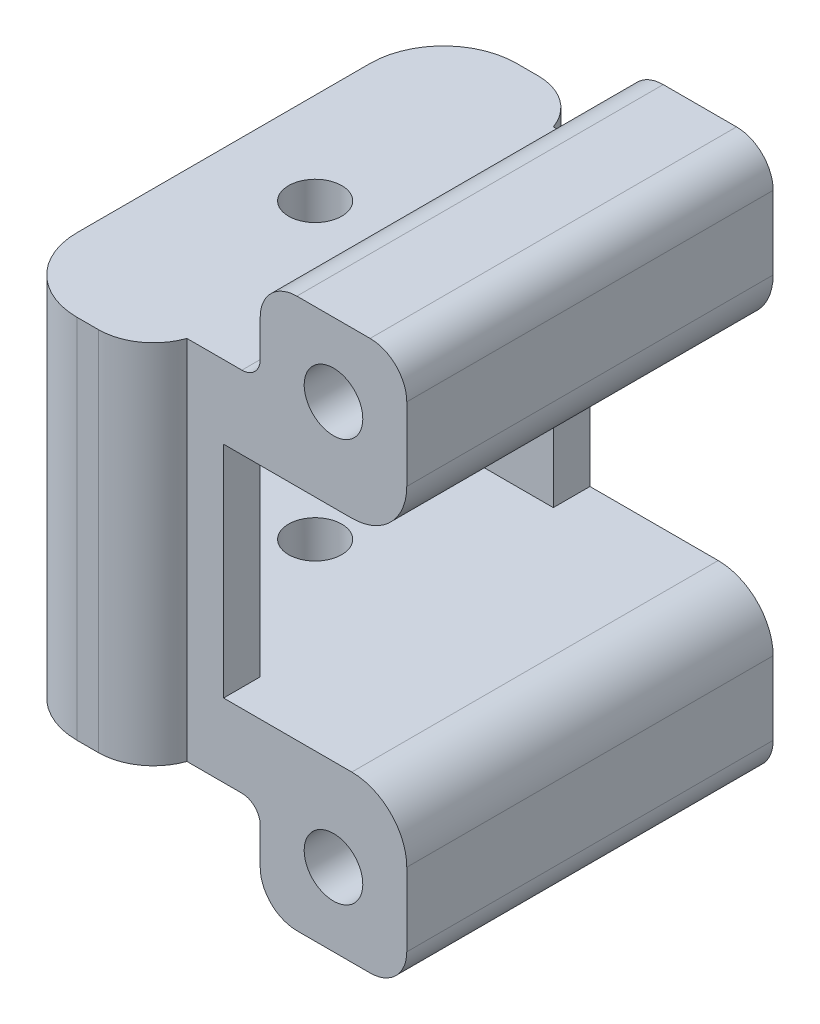
ISO-10303-21;
HEADER;
FILE_DESCRIPTION(('STEP AP214'),'2;1');
FILE_NAME('part.step','',(''),(''),'','','');
FILE_SCHEMA(('AUTOMOTIVE_DESIGN { 1 0 10303 214 1 1 1 1 }'));
ENDSEC;
DATA;
#1=APPLICATION_CONTEXT('core data for automotive mechanical design processes');
#2=APPLICATION_PROTOCOL_DEFINITION('international standard','automotive_design',2000,#1);
#3=PRODUCT_CONTEXT('',#1,'mechanical');
#4=PRODUCT('Part','Part','',(#3));
#5=PRODUCT_RELATED_PRODUCT_CATEGORY('part','',(#4));
#6=PRODUCT_DEFINITION_FORMATION('','',#4);
#7=PRODUCT_DEFINITION_CONTEXT('part definition',#1,'design');
#8=PRODUCT_DEFINITION('design','',#6,#7);
#9=PRODUCT_DEFINITION_SHAPE('','',#8);
#10=(LENGTH_UNIT() NAMED_UNIT(*) SI_UNIT(.MILLI.,.METRE.));
#11=(NAMED_UNIT(*) PLANE_ANGLE_UNIT() SI_UNIT($,.RADIAN.));
#12=(NAMED_UNIT(*) SI_UNIT($,.STERADIAN.) SOLID_ANGLE_UNIT());
#13=UNCERTAINTY_MEASURE_WITH_UNIT(LENGTH_MEASURE(1.E-05),#10,'distance_accuracy_value','');
#14=(GEOMETRIC_REPRESENTATION_CONTEXT(3) GLOBAL_UNCERTAINTY_ASSIGNED_CONTEXT((#13)) GLOBAL_UNIT_ASSIGNED_CONTEXT((#10,
#11,#12)) REPRESENTATION_CONTEXT('',''));
#15=CARTESIAN_POINT('',(0.,0.,0.));
#16=DIRECTION('',(0.,0.,1.));
#17=DIRECTION('',(1.,0.,0.));
#18=AXIS2_PLACEMENT_3D('',#15,#16,#17);
#19=CARTESIAN_POINT('',(6.,0.,0.));
#20=DIRECTION('',(1.,0.,0.));
#21=DIRECTION('',(0.,0.,-1.));
#22=AXIS2_PLACEMENT_3D('',#19,#20,#21);
#23=PLANE('',#22);
#24=DIRECTION('',(0.,0.,1.));
#25=VECTOR('',#24,1.);
#26=CARTESIAN_POINT('',(6.,0.,0.));
#27=LINE('',#26,#25);
#28=CARTESIAN_POINT('',(6.,0.,2.));
#29=VERTEX_POINT('',#28);
#30=CARTESIAN_POINT('',(6.,0.,18.));
#31=VERTEX_POINT('',#30);
#32=EDGE_CURVE('E235',#29,#31,#27,.T.);
#33=ORIENTED_EDGE('',*,*,#32,.F.);
#34=DIRECTION('',(0.,1.,0.));
#35=VECTOR('',#34,1.);
#36=CARTESIAN_POINT('',(6.,-20.,2.));
#37=LINE('',#36,#35);
#38=CARTESIAN_POINT('',(6.,-4.00000000000002,2.));
#39=VERTEX_POINT('',#38);
#40=EDGE_CURVE('E230',#29,#39,#37,.F.);
#41=ORIENTED_EDGE('',*,*,#40,.T.);
#42=DIRECTION('',(0.,0.,-1.));
#43=VECTOR('',#42,1.);
#44=CARTESIAN_POINT('',(6.,-4.,0.));
#45=LINE('',#44,#43);
#46=CARTESIAN_POINT('',(6.,-4.00000000000001,18.));
#47=VERTEX_POINT('',#46);
#48=EDGE_CURVE('E232',#47,#39,#45,.T.);
#49=ORIENTED_EDGE('',*,*,#48,.F.);
#50=DIRECTION('',(0.,-1.,0.));
#51=VECTOR('',#50,1.);
#52=CARTESIAN_POINT('',(6.,0.,18.));
#53=LINE('',#52,#51);
#54=EDGE_CURVE('E453',#47,#31,#53,.F.);
#55=ORIENTED_EDGE('',*,*,#54,.T.);
#56=EDGE_LOOP('',(#33,#41,#49,#55));
#57=FACE_BOUND('',#56,.T.);
#58=ADVANCED_FACE('F35',(#57),#23,.F.);
#59=CARTESIAN_POINT('',(4.,0.,0.));
#60=DIRECTION('',(0.,0.,1.));
#61=DIRECTION('',(0.,-1.,0.));
#62=AXIS2_PLACEMENT_3D('',#59,#60,#61);
#63=PLANE('',#62);
#64=CARTESIAN_POINT('',(22.,1.,0.));
#65=DIRECTION('',(0.,0.,-1.));
#66=DIRECTION('',(0.,1.,0.));
#67=AXIS2_PLACEMENT_3D('',#64,#65,#66);
#68=CIRCLE('',#67,1.6);
#69=CARTESIAN_POINT('',(22.,2.6,0.));
#70=VERTEX_POINT('',#69);
#71=EDGE_CURVE('E316',#70,#70,#68,.T.);
#72=ORIENTED_EDGE('',*,*,#71,.F.);
#73=EDGE_LOOP('',(#72));
#74=FACE_BOUND('',#73,.T.);
#75=CARTESIAN_POINT('',(21.9999999999991,-21.,0.));
#76=DIRECTION('',(0.,0.,-1.));
#77=DIRECTION('',(0.,1.,0.));
#78=AXIS2_PLACEMENT_3D('',#75,#76,#77);
#79=CIRCLE('',#78,1.6);
#80=CARTESIAN_POINT('',(21.9999999999991,-19.4,0.));
#81=VERTEX_POINT('',#80);
#82=EDGE_CURVE('E312',#81,#81,#79,.T.);
#83=ORIENTED_EDGE('',*,*,#82,.F.);
#84=EDGE_LOOP('',(#83));
#85=FACE_BOUND('',#84,.T.);
#86=DIRECTION('',(1.,0.,0.));
#87=VECTOR('',#86,1.);
#88=CARTESIAN_POINT('',(26.,-25.,0.));
#89=LINE('',#88,#87);
#90=CARTESIAN_POINT('',(20.,-25.,0.));
#91=VERTEX_POINT('',#90);
#92=CARTESIAN_POINT('',(24.,-25.,0.));
#93=VERTEX_POINT('',#92);
#94=EDGE_CURVE('E338',#91,#93,#89,.T.);
#95=ORIENTED_EDGE('',*,*,#94,.F.);
#96=CARTESIAN_POINT('',(20.,-23.,0.));
#97=DIRECTION('',(0.,0.,1.));
#98=DIRECTION('',(0.,-1.,0.));
#99=AXIS2_PLACEMENT_3D('',#96,#97,#98);
#100=CIRCLE('',#99,2.);
#101=CARTESIAN_POINT('',(18.,-23.,0.));
#102=VERTEX_POINT('',#101);
#103=EDGE_CURVE('E421',#91,#102,#100,.F.);
#104=ORIENTED_EDGE('',*,*,#103,.T.);
#105=DIRECTION('',(0.,1.,0.));
#106=VECTOR('',#105,1.);
#107=CARTESIAN_POINT('',(18.,-25.,0.));
#108=LINE('',#107,#106);
#109=CARTESIAN_POINT('',(18.,-21.,0.));
#110=VERTEX_POINT('',#109);
#111=EDGE_CURVE('E341',#102,#110,#108,.T.);
#112=ORIENTED_EDGE('',*,*,#111,.T.);
#113=CARTESIAN_POINT('',(17.,-21.,0.));
#114=DIRECTION('',(0.,0.,1.));
#115=DIRECTION('',(0.,-1.,0.));
#116=AXIS2_PLACEMENT_3D('',#113,#114,#115);
#117=CIRCLE('',#116,1.);
#118=CARTESIAN_POINT('',(17.,-20.,0.));
#119=VERTEX_POINT('',#118);
#120=EDGE_CURVE('E486',#110,#119,#117,.T.);
#121=ORIENTED_EDGE('',*,*,#120,.T.);
#122=DIRECTION('',(-1.,0.,0.));
#123=VECTOR('',#122,1.);
#124=CARTESIAN_POINT('',(4.,-20.,0.));
#125=LINE('',#124,#123);
#126=CARTESIAN_POINT('',(14.,-20.,0.));
#127=VERTEX_POINT('',#126);
#128=EDGE_CURVE('E377',#119,#127,#125,.T.);
#129=ORIENTED_EDGE('',*,*,#128,.T.);
#130=DIRECTION('',(0.,-1.,0.));
#131=VECTOR('',#130,1.);
#132=CARTESIAN_POINT('',(14.,-20.,0.));
#133=LINE('',#132,#131);
#134=CARTESIAN_POINT('',(14.,0.,0.));
#135=VERTEX_POINT('',#134);
#136=EDGE_CURVE('E280',#135,#127,#133,.T.);
#137=ORIENTED_EDGE('',*,*,#136,.F.);
#138=DIRECTION('',(-1.,0.,0.));
#139=VECTOR('',#138,1.);
#140=CARTESIAN_POINT('',(4.,0.,0.));
#141=LINE('',#140,#139);
#142=CARTESIAN_POINT('',(17.,0.,0.));
#143=VERTEX_POINT('',#142);
#144=EDGE_CURVE('E383',#143,#135,#141,.T.);
#145=ORIENTED_EDGE('',*,*,#144,.F.);
#146=CARTESIAN_POINT('',(17.,1.,0.));
#147=DIRECTION('',(0.,0.,1.));
#148=DIRECTION('',(0.,-1.,0.));
#149=AXIS2_PLACEMENT_3D('',#146,#147,#148);
#150=CIRCLE('',#149,1.);
#151=CARTESIAN_POINT('',(18.,1.,0.));
#152=VERTEX_POINT('',#151);
#153=EDGE_CURVE('E11',#143,#152,#150,.T.);
#154=ORIENTED_EDGE('',*,*,#153,.T.);
#155=DIRECTION('',(0.,-1.,0.));
#156=VECTOR('',#155,1.);
#157=CARTESIAN_POINT('',(18.,5.,0.));
#158=LINE('',#157,#156);
#159=CARTESIAN_POINT('',(18.,3.,0.));
#160=VERTEX_POINT('',#159);
#161=EDGE_CURVE('E332',#160,#152,#158,.T.);
#162=ORIENTED_EDGE('',*,*,#161,.F.);
#163=CARTESIAN_POINT('',(20.,3.,0.));
#164=DIRECTION('',(0.,0.,1.));
#165=DIRECTION('',(0.,-1.,0.));
#166=AXIS2_PLACEMENT_3D('',#163,#164,#165);
#167=CIRCLE('',#166,2.);
#168=CARTESIAN_POINT('',(20.,5.,0.));
#169=VERTEX_POINT('',#168);
#170=EDGE_CURVE('E417',#160,#169,#167,.F.);
#171=ORIENTED_EDGE('',*,*,#170,.T.);
#172=DIRECTION('',(-1.,0.,0.));
#173=VECTOR('',#172,1.);
#174=CARTESIAN_POINT('',(26.,5.,0.));
#175=LINE('',#174,#173);
#176=CARTESIAN_POINT('',(24.,5.,0.));
#177=VERTEX_POINT('',#176);
#178=EDGE_CURVE('E322',#177,#169,#175,.T.);
#179=ORIENTED_EDGE('',*,*,#178,.F.);
#180=CARTESIAN_POINT('',(24.,3.,0.));
#181=DIRECTION('',(0.,0.,1.));
#182=DIRECTION('',(0.,-1.,0.));
#183=AXIS2_PLACEMENT_3D('',#180,#181,#182);
#184=CIRCLE('',#183,2.);
#185=CARTESIAN_POINT('',(26.,3.,0.));
#186=VERTEX_POINT('',#185);
#187=EDGE_CURVE('E415',#177,#186,#184,.F.);
#188=ORIENTED_EDGE('',*,*,#187,.T.);
#189=DIRECTION('',(0.,1.,0.));
#190=VECTOR('',#189,1.);
#191=CARTESIAN_POINT('',(26.,0.,0.));
#192=LINE('',#191,#190);
#193=CARTESIAN_POINT('',(26.,-1.,0.));
#194=VERTEX_POINT('',#193);
#195=EDGE_CURVE('E348',#194,#186,#192,.T.);
#196=ORIENTED_EDGE('',*,*,#195,.F.);
#197=CARTESIAN_POINT('',(23.,-1.,0.));
#198=DIRECTION('',(0.,0.,1.));
#199=DIRECTION('',(0.,-1.,0.));
#200=AXIS2_PLACEMENT_3D('',#197,#198,#199);
#201=CIRCLE('',#200,3.);
#202=CARTESIAN_POINT('',(23.,-4.,0.));
#203=VERTEX_POINT('',#202);
#204=EDGE_CURVE('E399',#194,#203,#201,.F.);
#205=ORIENTED_EDGE('',*,*,#204,.T.);
#206=DIRECTION('',(-1.,0.,0.));
#207=VECTOR('',#206,1.);
#208=CARTESIAN_POINT('',(26.,-4.,0.));
#209=LINE('',#208,#207);
#210=CARTESIAN_POINT('',(16.,-4.,0.));
#211=VERTEX_POINT('',#210);
#212=EDGE_CURVE('E353',#203,#211,#209,.T.);
#213=ORIENTED_EDGE('',*,*,#212,.T.);
#214=DIRECTION('',(0.,1.,0.));
#215=VECTOR('',#214,1.);
#216=CARTESIAN_POINT('',(16.,0.,0.));
#217=LINE('',#216,#215);
#218=CARTESIAN_POINT('',(16.,-16.,0.));
#219=VERTEX_POINT('',#218);
#220=EDGE_CURVE('E371',#219,#211,#217,.T.);
#221=ORIENTED_EDGE('',*,*,#220,.F.);
#222=DIRECTION('',(-1.,0.,0.));
#223=VECTOR('',#222,1.);
#224=CARTESIAN_POINT('',(26.,-16.,0.));
#225=LINE('',#224,#223);
#226=CARTESIAN_POINT('',(23.,-16.,0.));
#227=VERTEX_POINT('',#226);
#228=EDGE_CURVE('E369',#227,#219,#225,.T.);
#229=ORIENTED_EDGE('',*,*,#228,.F.);
#230=CARTESIAN_POINT('',(23.,-19.,0.));
#231=DIRECTION('',(0.,0.,1.));
#232=DIRECTION('',(0.,-1.,0.));
#233=AXIS2_PLACEMENT_3D('',#230,#231,#232);
#234=CIRCLE('',#233,3.);
#235=CARTESIAN_POINT('',(26.,-19.,0.));
#236=VERTEX_POINT('',#235);
#237=EDGE_CURVE('E401',#227,#236,#234,.F.);
#238=ORIENTED_EDGE('',*,*,#237,.T.);
#239=DIRECTION('',(0.,1.,0.));
#240=VECTOR('',#239,1.);
#241=CARTESIAN_POINT('',(26.,-20.,0.));
#242=LINE('',#241,#240);
#243=CARTESIAN_POINT('',(26.,-23.,0.));
#244=VERTEX_POINT('',#243);
#245=EDGE_CURVE('E359',#244,#236,#242,.T.);
#246=ORIENTED_EDGE('',*,*,#245,.F.);
#247=CARTESIAN_POINT('',(24.,-23.,0.));
#248=DIRECTION('',(0.,0.,1.));
#249=DIRECTION('',(0.,-1.,0.));
#250=AXIS2_PLACEMENT_3D('',#247,#248,#249);
#251=CIRCLE('',#250,2.);
#252=EDGE_CURVE('E419',#244,#93,#251,.F.);
#253=ORIENTED_EDGE('',*,*,#252,.T.);
#254=EDGE_LOOP('',(#95,#104,#112,#121,#129,#137,#145,#154,#162,#171,#179,#188,#196,#205,#213,
#221,#229,#238,#246,#253));
#255=FACE_BOUND('',#254,.T.);
#256=ADVANCED_FACE('F514',(#74,#85,#255),#63,.F.);
#257=CARTESIAN_POINT('',(4.,0.,20.));
#258=DIRECTION('',(0.,0.,-1.));
#259=DIRECTION('',(-1.,0.,0.));
#260=AXIS2_PLACEMENT_3D('',#257,#258,#259);
#261=PLANE('',#260);
#262=CARTESIAN_POINT('',(22.,1.,20.));
#263=DIRECTION('',(0.,0.,-1.));
#264=DIRECTION('',(0.,1.,0.));
#265=AXIS2_PLACEMENT_3D('',#262,#263,#264);
#266=CIRCLE('',#265,1.6);
#267=CARTESIAN_POINT('',(22.,2.6,20.));
#268=VERTEX_POINT('',#267);
#269=EDGE_CURVE('E319',#268,#268,#266,.T.);
#270=ORIENTED_EDGE('',*,*,#269,.T.);
#271=EDGE_LOOP('',(#270));
#272=FACE_BOUND('',#271,.T.);
#273=CARTESIAN_POINT('',(21.9999999999991,-21.,20.));
#274=DIRECTION('',(0.,0.,-1.));
#275=DIRECTION('',(0.,1.,0.));
#276=AXIS2_PLACEMENT_3D('',#273,#274,#275);
#277=CIRCLE('',#276,1.6);
#278=CARTESIAN_POINT('',(21.9999999999991,-19.4,20.));
#279=VERTEX_POINT('',#278);
#280=EDGE_CURVE('E313',#279,#279,#277,.T.);
#281=ORIENTED_EDGE('',*,*,#280,.T.);
#282=EDGE_LOOP('',(#281));
#283=FACE_BOUND('',#282,.T.);
#284=DIRECTION('',(0.,1.,0.));
#285=VECTOR('',#284,1.);
#286=CARTESIAN_POINT('',(18.,-25.,20.));
#287=LINE('',#286,#285);
#288=CARTESIAN_POINT('',(18.,-23.,20.));
#289=VERTEX_POINT('',#288);
#290=CARTESIAN_POINT('',(18.,-21.,20.));
#291=VERTEX_POINT('',#290);
#292=EDGE_CURVE('E344',#289,#291,#287,.T.);
#293=ORIENTED_EDGE('',*,*,#292,.F.);
#294=CARTESIAN_POINT('',(20.,-23.,20.));
#295=DIRECTION('',(0.,0.,-1.));
#296=DIRECTION('',(-1.,0.,0.));
#297=AXIS2_PLACEMENT_3D('',#294,#295,#296);
#298=CIRCLE('',#297,2.);
#299=CARTESIAN_POINT('',(20.,-25.,20.));
#300=VERTEX_POINT('',#299);
#301=EDGE_CURVE('E431',#289,#300,#298,.F.);
#302=ORIENTED_EDGE('',*,*,#301,.T.);
#303=DIRECTION('',(-1.,0.,0.));
#304=VECTOR('',#303,1.);
#305=CARTESIAN_POINT('',(26.,-25.,20.));
#306=LINE('',#305,#304);
#307=CARTESIAN_POINT('',(24.,-25.,20.));
#308=VERTEX_POINT('',#307);
#309=EDGE_CURVE('E335',#308,#300,#306,.T.);
#310=ORIENTED_EDGE('',*,*,#309,.F.);
#311=CARTESIAN_POINT('',(24.,-23.,20.));
#312=DIRECTION('',(0.,0.,-1.));
#313=DIRECTION('',(-1.,0.,0.));
#314=AXIS2_PLACEMENT_3D('',#311,#312,#313);
#315=CIRCLE('',#314,2.);
#316=CARTESIAN_POINT('',(26.,-23.,20.));
#317=VERTEX_POINT('',#316);
#318=EDGE_CURVE('E429',#308,#317,#315,.F.);
#319=ORIENTED_EDGE('',*,*,#318,.T.);
#320=DIRECTION('',(0.,-1.,0.));
#321=VECTOR('',#320,1.);
#322=CARTESIAN_POINT('',(26.,-20.,20.));
#323=LINE('',#322,#321);
#324=CARTESIAN_POINT('',(26.,-19.,20.));
#325=VERTEX_POINT('',#324);
#326=EDGE_CURVE('E361',#325,#317,#323,.T.);
#327=ORIENTED_EDGE('',*,*,#326,.F.);
#328=CARTESIAN_POINT('',(23.,-19.,20.));
#329=DIRECTION('',(0.,0.,-1.));
#330=DIRECTION('',(-1.,0.,0.));
#331=AXIS2_PLACEMENT_3D('',#328,#329,#330);
#332=CIRCLE('',#331,3.);
#333=CARTESIAN_POINT('',(23.,-16.,20.));
#334=VERTEX_POINT('',#333);
#335=EDGE_CURVE('E395',#325,#334,#332,.F.);
#336=ORIENTED_EDGE('',*,*,#335,.T.);
#337=DIRECTION('',(-1.,0.,0.));
#338=VECTOR('',#337,1.);
#339=CARTESIAN_POINT('',(26.,-16.,20.));
#340=LINE('',#339,#338);
#341=CARTESIAN_POINT('',(16.,-16.,20.));
#342=VERTEX_POINT('',#341);
#343=EDGE_CURVE('E364',#334,#342,#340,.T.);
#344=ORIENTED_EDGE('',*,*,#343,.T.);
#345=DIRECTION('',(0.,-1.,0.));
#346=VECTOR('',#345,1.);
#347=CARTESIAN_POINT('',(16.,0.,20.));
#348=LINE('',#347,#346);
#349=CARTESIAN_POINT('',(16.,-4.,20.));
#350=VERTEX_POINT('',#349);
#351=EDGE_CURVE('E374',#350,#342,#348,.T.);
#352=ORIENTED_EDGE('',*,*,#351,.F.);
#353=DIRECTION('',(-1.,0.,0.));
#354=VECTOR('',#353,1.);
#355=CARTESIAN_POINT('',(26.,-4.,20.));
#356=LINE('',#355,#354);
#357=CARTESIAN_POINT('',(23.,-4.,20.));
#358=VERTEX_POINT('',#357);
#359=EDGE_CURVE('E356',#358,#350,#356,.T.);
#360=ORIENTED_EDGE('',*,*,#359,.F.);
#361=CARTESIAN_POINT('',(23.,-1.,20.));
#362=DIRECTION('',(0.,0.,-1.));
#363=DIRECTION('',(-1.,0.,0.));
#364=AXIS2_PLACEMENT_3D('',#361,#362,#363);
#365=CIRCLE('',#364,3.);
#366=CARTESIAN_POINT('',(26.,-1.,20.));
#367=VERTEX_POINT('',#366);
#368=EDGE_CURVE('E392',#358,#367,#365,.F.);
#369=ORIENTED_EDGE('',*,*,#368,.T.);
#370=DIRECTION('',(0.,-1.,0.));
#371=VECTOR('',#370,1.);
#372=CARTESIAN_POINT('',(26.,0.,20.));
#373=LINE('',#372,#371);
#374=CARTESIAN_POINT('',(26.,3.,20.));
#375=VERTEX_POINT('',#374);
#376=EDGE_CURVE('E351',#375,#367,#373,.T.);
#377=ORIENTED_EDGE('',*,*,#376,.F.);
#378=CARTESIAN_POINT('',(24.,3.,20.));
#379=DIRECTION('',(0.,0.,-1.));
#380=DIRECTION('',(-1.,0.,0.));
#381=AXIS2_PLACEMENT_3D('',#378,#379,#380);
#382=CIRCLE('',#381,2.);
#383=CARTESIAN_POINT('',(24.,5.,20.));
#384=VERTEX_POINT('',#383);
#385=EDGE_CURVE('E425',#375,#384,#382,.F.);
#386=ORIENTED_EDGE('',*,*,#385,.T.);
#387=DIRECTION('',(1.,0.,0.));
#388=VECTOR('',#387,1.);
#389=CARTESIAN_POINT('',(26.,5.,20.));
#390=LINE('',#389,#388);
#391=CARTESIAN_POINT('',(20.,5.,20.));
#392=VERTEX_POINT('',#391);
#393=EDGE_CURVE('E327',#392,#384,#390,.T.);
#394=ORIENTED_EDGE('',*,*,#393,.F.);
#395=CARTESIAN_POINT('',(20.,3.,20.));
#396=DIRECTION('',(0.,0.,-1.));
#397=DIRECTION('',(-1.,0.,0.));
#398=AXIS2_PLACEMENT_3D('',#395,#396,#397);
#399=CIRCLE('',#398,2.);
#400=CARTESIAN_POINT('',(18.,3.,20.));
#401=VERTEX_POINT('',#400);
#402=EDGE_CURVE('E427',#392,#401,#399,.F.);
#403=ORIENTED_EDGE('',*,*,#402,.T.);
#404=DIRECTION('',(0.,-1.,0.));
#405=VECTOR('',#404,1.);
#406=CARTESIAN_POINT('',(18.,5.,20.));
#407=LINE('',#406,#405);
#408=CARTESIAN_POINT('',(18.,0.999999999999997,20.));
#409=VERTEX_POINT('',#408);
#410=EDGE_CURVE('E330',#401,#409,#407,.T.);
#411=ORIENTED_EDGE('',*,*,#410,.T.);
#412=CARTESIAN_POINT('',(17.,0.999999999999996,20.));
#413=DIRECTION('',(0.,0.,-1.));
#414=DIRECTION('',(-1.,0.,0.));
#415=AXIS2_PLACEMENT_3D('',#412,#413,#414);
#416=CIRCLE('',#415,1.);
#417=CARTESIAN_POINT('',(17.,0.,20.));
#418=VERTEX_POINT('',#417);
#419=EDGE_CURVE('E43',#409,#418,#416,.T.);
#420=ORIENTED_EDGE('',*,*,#419,.T.);
#421=DIRECTION('',(-1.,0.,0.));
#422=VECTOR('',#421,1.);
#423=CARTESIAN_POINT('',(4.,0.,20.));
#424=LINE('',#423,#422);
#425=CARTESIAN_POINT('',(14.,0.,20.));
#426=VERTEX_POINT('',#425);
#427=EDGE_CURVE('E381',#418,#426,#424,.T.);
#428=ORIENTED_EDGE('',*,*,#427,.T.);
#429=DIRECTION('',(0.,1.,0.));
#430=VECTOR('',#429,1.);
#431=CARTESIAN_POINT('',(14.,-20.,20.));
#432=LINE('',#431,#430);
#433=CARTESIAN_POINT('',(14.,-20.,20.));
#434=VERTEX_POINT('',#433);
#435=EDGE_CURVE('E286',#434,#426,#432,.T.);
#436=ORIENTED_EDGE('',*,*,#435,.F.);
#437=DIRECTION('',(-1.,0.,0.));
#438=VECTOR('',#437,1.);
#439=CARTESIAN_POINT('',(4.,-20.,20.));
#440=LINE('',#439,#438);
#441=CARTESIAN_POINT('',(17.,-20.,20.));
#442=VERTEX_POINT('',#441);
#443=EDGE_CURVE('E379',#442,#434,#440,.T.);
#444=ORIENTED_EDGE('',*,*,#443,.F.);
#445=CARTESIAN_POINT('',(17.,-21.,20.));
#446=DIRECTION('',(0.,0.,-1.));
#447=DIRECTION('',(-1.,0.,0.));
#448=AXIS2_PLACEMENT_3D('',#445,#446,#447);
#449=CIRCLE('',#448,1.);
#450=EDGE_CURVE('E488',#442,#291,#449,.T.);
#451=ORIENTED_EDGE('',*,*,#450,.T.);
#452=EDGE_LOOP('',(#293,#302,#310,#319,#327,#336,#344,#352,#360,#369,#377,#386,#394,#403,#411,
#420,#428,#436,#444,#451));
#453=FACE_BOUND('',#452,.T.);
#454=ADVANCED_FACE('F502',(#272,#283,#453),#261,.F.);
#455=CARTESIAN_POINT('',(4.,0.,0.));
#456=DIRECTION('',(0.,-1.,0.));
#457=DIRECTION('',(0.,0.,-1.));
#458=AXIS2_PLACEMENT_3D('',#455,#456,#457);
#459=PLANE('',#458);
#460=CARTESIAN_POINT('',(11.,0.,10.));
#461=DIRECTION('',(0.,1.,0.));
#462=DIRECTION('',(0.,0.,1.));
#463=AXIS2_PLACEMENT_3D('',#460,#461,#462);
#464=CIRCLE('',#463,1.45);
#465=CARTESIAN_POINT('',(11.,0.,11.45));
#466=VERTEX_POINT('',#465);
#467=EDGE_CURVE('E294',#466,#466,#464,.T.);
#468=ORIENTED_EDGE('',*,*,#467,.F.);
#469=EDGE_LOOP('',(#468));
#470=FACE_BOUND('',#469,.T.);
#471=ORIENTED_EDGE('',*,*,#427,.F.);
#472=DIRECTION('',(0.,0.,1.));
#473=VECTOR('',#472,1.);
#474=CARTESIAN_POINT('',(17.,0.,0.));
#475=LINE('',#474,#473);
#476=EDGE_CURVE('E56',#418,#143,#475,.F.);
#477=ORIENTED_EDGE('',*,*,#476,.T.);
#478=ORIENTED_EDGE('',*,*,#144,.T.);
#479=CARTESIAN_POINT('',(11.1715728752538,0.,1.));
#480=DIRECTION('',(0.,-1.,0.));
#481=DIRECTION('',(0.,0.,-1.));
#482=AXIS2_PLACEMENT_3D('',#479,#480,#481);
#483=CIRCLE('',#482,3.);
#484=CARTESIAN_POINT('',(11.1715728752538,0.,-2.));
#485=VERTEX_POINT('',#484);
#486=EDGE_CURVE('E476',#135,#485,#483,.F.);
#487=ORIENTED_EDGE('',*,*,#486,.T.);
#488=DIRECTION('',(1.,0.,0.));
#489=VECTOR('',#488,1.);
#490=CARTESIAN_POINT('',(6.,0.,-2.));
#491=LINE('',#490,#489);
#492=CARTESIAN_POINT('',(10.,0.,-2.));
#493=VERTEX_POINT('',#492);
#494=EDGE_CURVE('E281',#493,#485,#491,.T.);
#495=ORIENTED_EDGE('',*,*,#494,.F.);
#496=CARTESIAN_POINT('',(10.,0.,2.));
#497=DIRECTION('',(0.,-1.,0.));
#498=DIRECTION('',(0.,0.,-1.));
#499=AXIS2_PLACEMENT_3D('',#496,#497,#498);
#500=CIRCLE('',#499,4.);
#501=EDGE_CURVE('E451',#493,#29,#500,.F.);
#502=ORIENTED_EDGE('',*,*,#501,.T.);
#503=ORIENTED_EDGE('',*,*,#32,.T.);
#504=CARTESIAN_POINT('',(10.,0.,18.));
#505=DIRECTION('',(0.,-1.,0.));
#506=DIRECTION('',(0.,0.,-1.));
#507=AXIS2_PLACEMENT_3D('',#504,#505,#506);
#508=CIRCLE('',#507,4.);
#509=CARTESIAN_POINT('',(10.,0.,22.));
#510=VERTEX_POINT('',#509);
#511=EDGE_CURVE('E448',#31,#510,#508,.F.);
#512=ORIENTED_EDGE('',*,*,#511,.T.);
#513=DIRECTION('',(-1.,0.,0.));
#514=VECTOR('',#513,1.);
#515=CARTESIAN_POINT('',(6.,0.,22.));
#516=LINE('',#515,#514);
#517=CARTESIAN_POINT('',(11.1715728752538,0.,22.));
#518=VERTEX_POINT('',#517);
#519=EDGE_CURVE('E292',#518,#510,#516,.T.);
#520=ORIENTED_EDGE('',*,*,#519,.F.);
#521=CARTESIAN_POINT('',(11.1715728752538,0.,19.));
#522=DIRECTION('',(0.,-1.,0.));
#523=DIRECTION('',(0.,0.,-1.));
#524=AXIS2_PLACEMENT_3D('',#521,#522,#523);
#525=CIRCLE('',#524,3.);
#526=EDGE_CURVE('E473',#518,#426,#525,.F.);
#527=ORIENTED_EDGE('',*,*,#526,.T.);
#528=EDGE_LOOP('',(#471,#477,#478,#487,#495,#502,#503,#512,#520,#527));
#529=FACE_BOUND('',#528,.T.);
#530=ADVANCED_FACE('F614',(#470,#529),#459,.F.);
#531=CARTESIAN_POINT('',(4.,-20.,0.));
#532=DIRECTION('',(0.,1.,0.));
#533=DIRECTION('',(0.,0.,1.));
#534=AXIS2_PLACEMENT_3D('',#531,#532,#533);
#535=PLANE('',#534);
#536=CARTESIAN_POINT('',(11.,-20.,10.));
#537=DIRECTION('',(0.,1.,0.));
#538=DIRECTION('',(0.,0.,1.));
#539=AXIS2_PLACEMENT_3D('',#536,#537,#538);
#540=CIRCLE('',#539,1.45);
#541=CARTESIAN_POINT('',(11.,-20.,11.45));
#542=VERTEX_POINT('',#541);
#543=EDGE_CURVE('E303',#542,#542,#540,.T.);
#544=ORIENTED_EDGE('',*,*,#543,.T.);
#545=EDGE_LOOP('',(#544));
#546=FACE_BOUND('',#545,.T.);
#547=ORIENTED_EDGE('',*,*,#128,.F.);
#548=DIRECTION('',(0.,0.,-1.));
#549=VECTOR('',#548,1.);
#550=CARTESIAN_POINT('',(17.,-20.,20.));
#551=LINE('',#550,#549);
#552=EDGE_CURVE('E484',#119,#442,#551,.F.);
#553=ORIENTED_EDGE('',*,*,#552,.T.);
#554=ORIENTED_EDGE('',*,*,#443,.T.);
#555=CARTESIAN_POINT('',(11.1715728752538,-20.,19.));
#556=DIRECTION('',(0.,1.,0.));
#557=DIRECTION('',(0.,0.,1.));
#558=AXIS2_PLACEMENT_3D('',#555,#556,#557);
#559=CIRCLE('',#558,3.);
#560=CARTESIAN_POINT('',(11.1715728752538,-20.,22.));
#561=VERTEX_POINT('',#560);
#562=EDGE_CURVE('E468',#434,#561,#559,.F.);
#563=ORIENTED_EDGE('',*,*,#562,.T.);
#564=DIRECTION('',(1.,0.,0.));
#565=VECTOR('',#564,1.);
#566=CARTESIAN_POINT('',(6.,-20.,22.));
#567=LINE('',#566,#565);
#568=CARTESIAN_POINT('',(10.,-20.,22.));
#569=VERTEX_POINT('',#568);
#570=EDGE_CURVE('E289',#569,#561,#567,.T.);
#571=ORIENTED_EDGE('',*,*,#570,.F.);
#572=CARTESIAN_POINT('',(10.,-20.,18.));
#573=DIRECTION('',(0.,1.,0.));
#574=DIRECTION('',(0.,0.,1.));
#575=AXIS2_PLACEMENT_3D('',#572,#573,#574);
#576=CIRCLE('',#575,4.);
#577=CARTESIAN_POINT('',(6.,-20.,18.));
#578=VERTEX_POINT('',#577);
#579=EDGE_CURVE('E238',#569,#578,#576,.F.);
#580=ORIENTED_EDGE('',*,*,#579,.T.);
#581=DIRECTION('',(0.,0.,1.));
#582=VECTOR('',#581,1.);
#583=CARTESIAN_POINT('',(6.,-20.,0.));
#584=LINE('',#583,#582);
#585=CARTESIAN_POINT('',(6.,-20.,2.));
#586=VERTEX_POINT('',#585);
#587=EDGE_CURVE('E306',#586,#578,#584,.T.);
#588=ORIENTED_EDGE('',*,*,#587,.F.);
#589=CARTESIAN_POINT('',(10.,-20.,2.));
#590=DIRECTION('',(0.,1.,0.));
#591=DIRECTION('',(0.,0.,1.));
#592=AXIS2_PLACEMENT_3D('',#589,#590,#591);
#593=CIRCLE('',#592,4.);
#594=CARTESIAN_POINT('',(10.,-20.,-2.));
#595=VERTEX_POINT('',#594);
#596=EDGE_CURVE('E459',#586,#595,#593,.F.);
#597=ORIENTED_EDGE('',*,*,#596,.T.);
#598=DIRECTION('',(-1.,0.,0.));
#599=VECTOR('',#598,1.);
#600=CARTESIAN_POINT('',(6.,-20.,-2.));
#601=LINE('',#600,#599);
#602=CARTESIAN_POINT('',(11.1715728752538,-20.,-2.));
#603=VERTEX_POINT('',#602);
#604=EDGE_CURVE('E284',#603,#595,#601,.T.);
#605=ORIENTED_EDGE('',*,*,#604,.F.);
#606=CARTESIAN_POINT('',(11.1715728752538,-20.,1.));
#607=DIRECTION('',(0.,1.,0.));
#608=DIRECTION('',(0.,0.,1.));
#609=AXIS2_PLACEMENT_3D('',#606,#607,#608);
#610=CIRCLE('',#609,3.);
#611=EDGE_CURVE('E470',#603,#127,#610,.F.);
#612=ORIENTED_EDGE('',*,*,#611,.T.);
#613=EDGE_LOOP('',(#547,#553,#554,#563,#571,#580,#588,#597,#605,#612));
#614=FACE_BOUND('',#613,.T.);
#615=ADVANCED_FACE('F606',(#546,#614),#535,.F.);
#616=CARTESIAN_POINT('',(16.,0.,0.));
#617=DIRECTION('',(1.,0.,0.));
#618=DIRECTION('',(0.,0.,-1.));
#619=AXIS2_PLACEMENT_3D('',#616,#617,#618);
#620=PLANE('',#619);
#621=DIRECTION('',(0.,1.,0.));
#622=VECTOR('',#621,1.);
#623=CARTESIAN_POINT('',(16.,0.,2.));
#624=LINE('',#623,#622);
#625=CARTESIAN_POINT('',(16.,-16.,2.));
#626=VERTEX_POINT('',#625);
#627=CARTESIAN_POINT('',(16.,-4.00000000000002,2.));
#628=VERTEX_POINT('',#627);
#629=EDGE_CURVE('E262',#626,#628,#624,.T.);
#630=ORIENTED_EDGE('',*,*,#629,.F.);
#631=DIRECTION('',(0.,0.,1.));
#632=VECTOR('',#631,1.);
#633=CARTESIAN_POINT('',(16.,-16.,0.));
#634=LINE('',#633,#632);
#635=EDGE_CURVE('E358',#219,#626,#634,.T.);
#636=ORIENTED_EDGE('',*,*,#635,.F.);
#637=ORIENTED_EDGE('',*,*,#220,.T.);
#638=DIRECTION('',(0.,0.,1.));
#639=VECTOR('',#638,1.);
#640=CARTESIAN_POINT('',(16.,-4.,0.));
#641=LINE('',#640,#639);
#642=EDGE_CURVE('E385',#211,#628,#641,.T.);
#643=ORIENTED_EDGE('',*,*,#642,.T.);
#644=EDGE_LOOP('',(#630,#636,#637,#643));
#645=FACE_BOUND('',#644,.T.);
#646=ADVANCED_FACE('F556',(#645),#620,.T.);
#647=DIRECTION('',(0.,-1.,0.));
#648=VECTOR('',#647,1.);
#649=CARTESIAN_POINT('',(16.,0.,18.));
#650=LINE('',#649,#648);
#651=CARTESIAN_POINT('',(16.,-4.00000000000001,18.));
#652=VERTEX_POINT('',#651);
#653=CARTESIAN_POINT('',(16.,-16.,18.));
#654=VERTEX_POINT('',#653);
#655=EDGE_CURVE('E278',#652,#654,#650,.T.);
#656=ORIENTED_EDGE('',*,*,#655,.F.);
#657=DIRECTION('',(0.,0.,-1.));
#658=VECTOR('',#657,1.);
#659=CARTESIAN_POINT('',(16.,-4.,0.));
#660=LINE('',#659,#658);
#661=EDGE_CURVE('E347',#350,#652,#660,.T.);
#662=ORIENTED_EDGE('',*,*,#661,.F.);
#663=ORIENTED_EDGE('',*,*,#351,.T.);
#664=EDGE_CURVE('E367',#654,#342,#634,.T.);
#665=ORIENTED_EDGE('',*,*,#664,.F.);
#666=EDGE_LOOP('',(#656,#662,#663,#665));
#667=FACE_BOUND('',#666,.T.);
#668=ADVANCED_FACE('F570',(#667),#620,.T.);
#669=CARTESIAN_POINT('',(16.,-4.,0.));
#670=DIRECTION('',(0.,1.,0.));
#671=DIRECTION('',(0.,0.,1.));
#672=AXIS2_PLACEMENT_3D('',#669,#670,#671);
#673=PLANE('',#672);
#674=ORIENTED_EDGE('',*,*,#212,.F.);
#675=DIRECTION('',(0.,0.,-1.));
#676=VECTOR('',#675,1.);
#677=CARTESIAN_POINT('',(23.,-4.,0.));
#678=LINE('',#677,#676);
#679=EDGE_CURVE('E407',#203,#358,#678,.F.);
#680=ORIENTED_EDGE('',*,*,#679,.T.);
#681=ORIENTED_EDGE('',*,*,#359,.T.);
#682=ORIENTED_EDGE('',*,*,#661,.T.);
#683=DIRECTION('',(-1.,0.,0.));
#684=VECTOR('',#683,1.);
#685=CARTESIAN_POINT('',(26.,-4.00000000000001,18.));
#686=LINE('',#685,#684);
#687=EDGE_CURVE('E252',#652,#47,#686,.T.);
#688=ORIENTED_EDGE('',*,*,#687,.T.);
#689=ORIENTED_EDGE('',*,*,#48,.T.);
#690=DIRECTION('',(-1.,0.,0.));
#691=VECTOR('',#690,1.);
#692=CARTESIAN_POINT('',(26.,-4.00000000000002,2.));
#693=LINE('',#692,#691);
#694=EDGE_CURVE('E249',#628,#39,#693,.T.);
#695=ORIENTED_EDGE('',*,*,#694,.F.);
#696=ORIENTED_EDGE('',*,*,#642,.F.);
#697=EDGE_LOOP('',(#674,#680,#681,#682,#688,#689,#695,#696));
#698=FACE_BOUND('',#697,.T.);
#699=CARTESIAN_POINT('',(11.,-4.,10.));
#700=DIRECTION('',(0.,1.,0.));
#701=DIRECTION('',(0.,0.,1.));
#702=AXIS2_PLACEMENT_3D('',#699,#700,#701);
#703=CIRCLE('',#702,1.45);
#704=CARTESIAN_POINT('',(11.,-4.,11.45));
#705=VERTEX_POINT('',#704);
#706=EDGE_CURVE('E300',#705,#705,#703,.T.);
#707=ORIENTED_EDGE('',*,*,#706,.T.);
#708=EDGE_LOOP('',(#707));
#709=FACE_BOUND('',#708,.T.);
#710=ADVANCED_FACE('F246',(#698,#709),#673,.F.);
#711=CARTESIAN_POINT('',(16.,-16.,0.));
#712=DIRECTION('',(0.,-1.,0.));
#713=DIRECTION('',(0.,0.,-1.));
#714=AXIS2_PLACEMENT_3D('',#711,#712,#713);
#715=PLANE('',#714);
#716=ORIENTED_EDGE('',*,*,#343,.F.);
#717=DIRECTION('',(0.,0.,1.));
#718=VECTOR('',#717,1.);
#719=CARTESIAN_POINT('',(23.,-16.,0.));
#720=LINE('',#719,#718);
#721=EDGE_CURVE('E397',#334,#227,#720,.F.);
#722=ORIENTED_EDGE('',*,*,#721,.T.);
#723=ORIENTED_EDGE('',*,*,#228,.T.);
#724=ORIENTED_EDGE('',*,*,#635,.T.);
#725=DIRECTION('',(-1.,0.,0.));
#726=VECTOR('',#725,1.);
#727=CARTESIAN_POINT('',(26.,-16.,2.));
#728=LINE('',#727,#726);
#729=CARTESIAN_POINT('',(6.,-16.,2.));
#730=VERTEX_POINT('',#729);
#731=EDGE_CURVE('E263',#626,#730,#728,.T.);
#732=ORIENTED_EDGE('',*,*,#731,.T.);
#733=DIRECTION('',(0.,0.,1.));
#734=VECTOR('',#733,1.);
#735=CARTESIAN_POINT('',(6.,-16.,0.));
#736=LINE('',#735,#734);
#737=CARTESIAN_POINT('',(6.,-16.,18.));
#738=VERTEX_POINT('',#737);
#739=EDGE_CURVE('E254',#730,#738,#736,.T.);
#740=ORIENTED_EDGE('',*,*,#739,.T.);
#741=DIRECTION('',(-1.,0.,0.));
#742=VECTOR('',#741,1.);
#743=CARTESIAN_POINT('',(26.,-16.,18.));
#744=LINE('',#743,#742);
#745=EDGE_CURVE('E272',#654,#738,#744,.T.);
#746=ORIENTED_EDGE('',*,*,#745,.F.);
#747=ORIENTED_EDGE('',*,*,#664,.T.);
#748=EDGE_LOOP('',(#716,#722,#723,#724,#732,#740,#746,#747));
#749=FACE_BOUND('',#748,.T.);
#750=CARTESIAN_POINT('',(11.,-16.,10.));
#751=DIRECTION('',(0.,-1.,0.));
#752=DIRECTION('',(0.,0.,-1.));
#753=AXIS2_PLACEMENT_3D('',#750,#751,#752);
#754=CIRCLE('',#753,1.45);
#755=CARTESIAN_POINT('',(11.,-16.,8.55));
#756=VERTEX_POINT('',#755);
#757=EDGE_CURVE('E299',#756,#756,#754,.T.);
#758=ORIENTED_EDGE('',*,*,#757,.T.);
#759=EDGE_LOOP('',(#758));
#760=FACE_BOUND('',#759,.T.);
#761=ADVANCED_FACE('F552',(#749,#760),#715,.F.);
#762=CARTESIAN_POINT('',(26.,0.,0.));
#763=DIRECTION('',(1.,0.,0.));
#764=DIRECTION('',(0.,0.,-1.));
#765=AXIS2_PLACEMENT_3D('',#762,#763,#764);
#766=PLANE('',#765);
#767=ORIENTED_EDGE('',*,*,#326,.T.);
#768=DIRECTION('',(0.,0.,1.));
#769=VECTOR('',#768,1.);
#770=CARTESIAN_POINT('',(26.,-23.,0.));
#771=LINE('',#770,#769);
#772=EDGE_CURVE('E433',#317,#244,#771,.F.);
#773=ORIENTED_EDGE('',*,*,#772,.T.);
#774=ORIENTED_EDGE('',*,*,#245,.T.);
#775=DIRECTION('',(0.,0.,1.));
#776=VECTOR('',#775,1.);
#777=CARTESIAN_POINT('',(26.,-19.,20.));
#778=LINE('',#777,#776);
#779=EDGE_CURVE('E387',#236,#325,#778,.T.);
#780=ORIENTED_EDGE('',*,*,#779,.T.);
#781=EDGE_LOOP('',(#767,#773,#774,#780));
#782=FACE_BOUND('',#781,.T.);
#783=ADVANCED_FACE('F668',(#782),#766,.T.);
#784=CARTESIAN_POINT('',(26.,0.,0.));
#785=DIRECTION('',(-1.,0.,0.));
#786=DIRECTION('',(0.,0.,1.));
#787=AXIS2_PLACEMENT_3D('',#784,#785,#786);
#788=PLANE('',#787);
#789=ORIENTED_EDGE('',*,*,#195,.T.);
#790=DIRECTION('',(0.,0.,-1.));
#791=VECTOR('',#790,1.);
#792=CARTESIAN_POINT('',(26.,3.,0.));
#793=LINE('',#792,#791);
#794=EDGE_CURVE('E443',#186,#375,#793,.F.);
#795=ORIENTED_EDGE('',*,*,#794,.T.);
#796=ORIENTED_EDGE('',*,*,#376,.T.);
#797=DIRECTION('',(0.,0.,-1.));
#798=VECTOR('',#797,1.);
#799=CARTESIAN_POINT('',(26.,-1.,0.));
#800=LINE('',#799,#798);
#801=EDGE_CURVE('E404',#367,#194,#800,.T.);
#802=ORIENTED_EDGE('',*,*,#801,.T.);
#803=EDGE_LOOP('',(#789,#795,#796,#802));
#804=FACE_BOUND('',#803,.T.);
#805=ADVANCED_FACE('F673',(#804),#788,.F.);
#806=CARTESIAN_POINT('',(18.,-25.,0.));
#807=DIRECTION('',(1.,0.,0.));
#808=DIRECTION('',(0.,0.,-1.));
#809=AXIS2_PLACEMENT_3D('',#806,#807,#808);
#810=PLANE('',#809);
#811=ORIENTED_EDGE('',*,*,#292,.T.);
#812=DIRECTION('',(0.,0.,-1.));
#813=VECTOR('',#812,1.);
#814=CARTESIAN_POINT('',(18.,-21.,0.));
#815=LINE('',#814,#813);
#816=EDGE_CURVE('E481',#291,#110,#815,.T.);
#817=ORIENTED_EDGE('',*,*,#816,.T.);
#818=ORIENTED_EDGE('',*,*,#111,.F.);
#819=DIRECTION('',(0.,0.,-1.));
#820=VECTOR('',#819,1.);
#821=CARTESIAN_POINT('',(18.,-23.,20.));
#822=LINE('',#821,#820);
#823=EDGE_CURVE('E423',#102,#289,#822,.F.);
#824=ORIENTED_EDGE('',*,*,#823,.T.);
#825=EDGE_LOOP('',(#811,#817,#818,#824));
#826=FACE_BOUND('',#825,.T.);
#827=ADVANCED_FACE('F600',(#826),#810,.F.);
#828=CARTESIAN_POINT('',(0.,-25.,0.));
#829=DIRECTION('',(0.,-1.,0.));
#830=DIRECTION('',(0.,0.,-1.));
#831=AXIS2_PLACEMENT_3D('',#828,#829,#830);
#832=PLANE('',#831);
#833=ORIENTED_EDGE('',*,*,#309,.T.);
#834=DIRECTION('',(0.,0.,-1.));
#835=VECTOR('',#834,1.);
#836=CARTESIAN_POINT('',(20.,-25.,0.));
#837=LINE('',#836,#835);
#838=EDGE_CURVE('E412',#300,#91,#837,.T.);
#839=ORIENTED_EDGE('',*,*,#838,.T.);
#840=ORIENTED_EDGE('',*,*,#94,.T.);
#841=DIRECTION('',(0.,0.,1.));
#842=VECTOR('',#841,1.);
#843=CARTESIAN_POINT('',(24.,-25.,0.));
#844=LINE('',#843,#842);
#845=EDGE_CURVE('E409',#93,#308,#844,.T.);
#846=ORIENTED_EDGE('',*,*,#845,.T.);
#847=EDGE_LOOP('',(#833,#839,#840,#846));
#848=FACE_BOUND('',#847,.T.);
#849=ADVANCED_FACE('F591',(#848),#832,.T.);
#850=CARTESIAN_POINT('',(18.,5.,0.));
#851=DIRECTION('',(1.,0.,0.));
#852=DIRECTION('',(0.,0.,-1.));
#853=AXIS2_PLACEMENT_3D('',#850,#851,#852);
#854=PLANE('',#853);
#855=ORIENTED_EDGE('',*,*,#161,.T.);
#856=DIRECTION('',(0.,0.,1.));
#857=VECTOR('',#856,1.);
#858=CARTESIAN_POINT('',(18.,0.999999999999996,20.));
#859=LINE('',#858,#857);
#860=EDGE_CURVE('E490',#152,#409,#859,.T.);
#861=ORIENTED_EDGE('',*,*,#860,.T.);
#862=ORIENTED_EDGE('',*,*,#410,.F.);
#863=DIRECTION('',(0.,0.,1.));
#864=VECTOR('',#863,1.);
#865=CARTESIAN_POINT('',(18.,3.,0.));
#866=LINE('',#865,#864);
#867=EDGE_CURVE('E441',#401,#160,#866,.F.);
#868=ORIENTED_EDGE('',*,*,#867,.T.);
#869=EDGE_LOOP('',(#855,#861,#862,#868));
#870=FACE_BOUND('',#869,.T.);
#871=ADVANCED_FACE('F496',(#870),#854,.F.);
#872=CARTESIAN_POINT('',(0.,5.,0.));
#873=DIRECTION('',(0.,-1.,0.));
#874=DIRECTION('',(0.,0.,-1.));
#875=AXIS2_PLACEMENT_3D('',#872,#873,#874);
#876=PLANE('',#875);
#877=ORIENTED_EDGE('',*,*,#178,.T.);
#878=DIRECTION('',(0.,0.,1.));
#879=VECTOR('',#878,1.);
#880=CARTESIAN_POINT('',(20.,5.,0.));
#881=LINE('',#880,#879);
#882=EDGE_CURVE('E438',#169,#392,#881,.T.);
#883=ORIENTED_EDGE('',*,*,#882,.T.);
#884=ORIENTED_EDGE('',*,*,#393,.T.);
#885=DIRECTION('',(0.,0.,-1.));
#886=VECTOR('',#885,1.);
#887=CARTESIAN_POINT('',(24.,5.,0.));
#888=LINE('',#887,#886);
#889=EDGE_CURVE('E435',#384,#177,#888,.T.);
#890=ORIENTED_EDGE('',*,*,#889,.T.);
#891=EDGE_LOOP('',(#877,#883,#884,#890));
#892=FACE_BOUND('',#891,.T.);
#893=ADVANCED_FACE('F509',(#892),#876,.F.);
#894=CARTESIAN_POINT('',(22.,1.,20.));
#895=DIRECTION('',(0.,0.,-1.));
#896=DIRECTION('',(0.,1.,0.));
#897=AXIS2_PLACEMENT_3D('',#894,#895,#896);
#898=CYLINDRICAL_SURFACE('',#897,1.6);
#899=ORIENTED_EDGE('',*,*,#269,.F.);
#900=EDGE_LOOP('',(#899));
#901=FACE_BOUND('',#900,.T.);
#902=ORIENTED_EDGE('',*,*,#71,.T.);
#903=EDGE_LOOP('',(#902));
#904=FACE_BOUND('',#903,.T.);
#905=ADVANCED_FACE('F545',(#901,#904),#898,.F.);
#906=CARTESIAN_POINT('',(21.9999999999991,-21.,20.));
#907=DIRECTION('',(0.,0.,-1.));
#908=DIRECTION('',(0.,1.,0.));
#909=AXIS2_PLACEMENT_3D('',#906,#907,#908);
#910=CYLINDRICAL_SURFACE('',#909,1.6);
#911=ORIENTED_EDGE('',*,*,#280,.F.);
#912=EDGE_LOOP('',(#911));
#913=FACE_BOUND('',#912,.T.);
#914=ORIENTED_EDGE('',*,*,#82,.T.);
#915=EDGE_LOOP('',(#914));
#916=FACE_BOUND('',#915,.T.);
#917=ADVANCED_FACE('F537',(#913,#916),#910,.F.);
#918=ORIENTED_EDGE('',*,*,#739,.F.);
#919=DIRECTION('',(0.,1.,0.));
#920=VECTOR('',#919,1.);
#921=CARTESIAN_POINT('',(6.,-20.,2.));
#922=LINE('',#921,#920);
#923=EDGE_CURVE('E239',#730,#586,#922,.F.);
#924=ORIENTED_EDGE('',*,*,#923,.T.);
#925=ORIENTED_EDGE('',*,*,#587,.T.);
#926=DIRECTION('',(0.,-1.,0.));
#927=VECTOR('',#926,1.);
#928=CARTESIAN_POINT('',(6.,0.,18.));
#929=LINE('',#928,#927);
#930=EDGE_CURVE('E455',#578,#738,#929,.F.);
#931=ORIENTED_EDGE('',*,*,#930,.T.);
#932=EDGE_LOOP('',(#918,#924,#925,#931));
#933=FACE_BOUND('',#932,.T.);
#934=ADVANCED_FACE('F526',(#933),#23,.F.);
#935=CARTESIAN_POINT('',(11.,-25.,10.));
#936=DIRECTION('',(0.,1.,0.));
#937=DIRECTION('',(0.,0.,1.));
#938=AXIS2_PLACEMENT_3D('',#935,#936,#937);
#939=CYLINDRICAL_SURFACE('',#938,1.45);
#940=ORIENTED_EDGE('',*,*,#757,.F.);
#941=EDGE_LOOP('',(#940));
#942=FACE_BOUND('',#941,.T.);
#943=ORIENTED_EDGE('',*,*,#543,.F.);
#944=EDGE_LOOP('',(#943));
#945=FACE_BOUND('',#944,.T.);
#946=ADVANCED_FACE('F536',(#942,#945),#939,.F.);
#947=ORIENTED_EDGE('',*,*,#467,.T.);
#948=EDGE_LOOP('',(#947));
#949=FACE_BOUND('',#948,.T.);
#950=ORIENTED_EDGE('',*,*,#706,.F.);
#951=EDGE_LOOP('',(#950));
#952=FACE_BOUND('',#951,.T.);
#953=ADVANCED_FACE('F543',(#949,#952),#939,.F.);
#954=CARTESIAN_POINT('',(0.,0.,22.));
#955=DIRECTION('',(0.,0.,-1.));
#956=DIRECTION('',(-1.,0.,0.));
#957=AXIS2_PLACEMENT_3D('',#954,#955,#956);
#958=PLANE('',#957);
#959=ORIENTED_EDGE('',*,*,#570,.T.);
#960=DIRECTION('',(0.,-1.,0.));
#961=VECTOR('',#960,1.);
#962=CARTESIAN_POINT('',(11.1715728752538,0.,22.));
#963=LINE('',#962,#961);
#964=EDGE_CURVE('E478',#561,#518,#963,.F.);
#965=ORIENTED_EDGE('',*,*,#964,.T.);
#966=ORIENTED_EDGE('',*,*,#519,.T.);
#967=DIRECTION('',(0.,-1.,0.));
#968=VECTOR('',#967,1.);
#969=CARTESIAN_POINT('',(10.,0.,22.));
#970=LINE('',#969,#968);
#971=EDGE_CURVE('E462',#510,#569,#970,.T.);
#972=ORIENTED_EDGE('',*,*,#971,.T.);
#973=EDGE_LOOP('',(#959,#965,#966,#972));
#974=FACE_BOUND('',#973,.T.);
#975=ADVANCED_FACE('F625',(#974),#958,.F.);
#976=CARTESIAN_POINT('',(0.,0.,-2.));
#977=DIRECTION('',(0.,0.,-1.));
#978=DIRECTION('',(0.,1.,0.));
#979=AXIS2_PLACEMENT_3D('',#976,#977,#978);
#980=PLANE('',#979);
#981=ORIENTED_EDGE('',*,*,#494,.T.);
#982=DIRECTION('',(0.,-1.,0.));
#983=VECTOR('',#982,1.);
#984=CARTESIAN_POINT('',(11.1715728752538,-20.,-2.));
#985=LINE('',#984,#983);
#986=EDGE_CURVE('E465',#485,#603,#985,.T.);
#987=ORIENTED_EDGE('',*,*,#986,.T.);
#988=ORIENTED_EDGE('',*,*,#604,.T.);
#989=DIRECTION('',(0.,1.,0.));
#990=VECTOR('',#989,1.);
#991=CARTESIAN_POINT('',(10.,0.,-2.));
#992=LINE('',#991,#990);
#993=EDGE_CURVE('E445',#595,#493,#992,.T.);
#994=ORIENTED_EDGE('',*,*,#993,.T.);
#995=EDGE_LOOP('',(#981,#987,#988,#994));
#996=FACE_BOUND('',#995,.T.);
#997=ADVANCED_FACE('F616',(#996),#980,.T.);
#998=CARTESIAN_POINT('',(26.,-4.00000000000001,18.));
#999=DIRECTION('',(0.,0.,1.));
#1000=DIRECTION('',(1.,0.,0.));
#1001=AXIS2_PLACEMENT_3D('',#998,#999,#1000);
#1002=PLANE('',#1001);
#1003=ORIENTED_EDGE('',*,*,#655,.T.);
#1004=ORIENTED_EDGE('',*,*,#745,.T.);
#1005=DIRECTION('',(0.,1.,0.));
#1006=VECTOR('',#1005,1.);
#1007=CARTESIAN_POINT('',(6.,-4.00000000000001,18.));
#1008=LINE('',#1007,#1006);
#1009=EDGE_CURVE('E267',#738,#47,#1008,.T.);
#1010=ORIENTED_EDGE('',*,*,#1009,.T.);
#1011=ORIENTED_EDGE('',*,*,#687,.F.);
#1012=EDGE_LOOP('',(#1003,#1004,#1010,#1011));
#1013=FACE_BOUND('',#1012,.T.);
#1014=ADVANCED_FACE('F574',(#1013),#1002,.F.);
#1015=CARTESIAN_POINT('',(26.,-4.00000000000002,2.));
#1016=DIRECTION('',(0.,0.,-1.));
#1017=DIRECTION('',(0.,1.,0.));
#1018=AXIS2_PLACEMENT_3D('',#1015,#1016,#1017);
#1019=PLANE('',#1018);
#1020=ORIENTED_EDGE('',*,*,#629,.T.);
#1021=ORIENTED_EDGE('',*,*,#694,.T.);
#1022=DIRECTION('',(0.,-1.,0.));
#1023=VECTOR('',#1022,1.);
#1024=CARTESIAN_POINT('',(6.,-4.00000000000002,2.));
#1025=LINE('',#1024,#1023);
#1026=EDGE_CURVE('E259',#39,#730,#1025,.T.);
#1027=ORIENTED_EDGE('',*,*,#1026,.T.);
#1028=ORIENTED_EDGE('',*,*,#731,.F.);
#1029=EDGE_LOOP('',(#1020,#1021,#1027,#1028));
#1030=FACE_BOUND('',#1029,.T.);
#1031=ADVANCED_FACE('F258',(#1030),#1019,.F.);
#1032=CARTESIAN_POINT('',(23.,-19.,0.));
#1033=DIRECTION('',(0.,0.,-1.));
#1034=DIRECTION('',(-1.,0.,0.));
#1035=AXIS2_PLACEMENT_3D('',#1032,#1033,#1034);
#1036=CYLINDRICAL_SURFACE('',#1035,3.);
#1037=ORIENTED_EDGE('',*,*,#237,.F.);
#1038=ORIENTED_EDGE('',*,*,#721,.F.);
#1039=ORIENTED_EDGE('',*,*,#335,.F.);
#1040=ORIENTED_EDGE('',*,*,#779,.F.);
#1041=EDGE_LOOP('',(#1037,#1038,#1039,#1040));
#1042=FACE_BOUND('',#1041,.T.);
#1043=ADVANCED_FACE('F580',(#1042),#1036,.T.);
#1044=CARTESIAN_POINT('',(23.,-1.,0.));
#1045=DIRECTION('',(0.,0.,-1.));
#1046=DIRECTION('',(0.,1.,0.));
#1047=AXIS2_PLACEMENT_3D('',#1044,#1045,#1046);
#1048=CYLINDRICAL_SURFACE('',#1047,3.);
#1049=ORIENTED_EDGE('',*,*,#368,.F.);
#1050=ORIENTED_EDGE('',*,*,#679,.F.);
#1051=ORIENTED_EDGE('',*,*,#204,.F.);
#1052=ORIENTED_EDGE('',*,*,#801,.F.);
#1053=EDGE_LOOP('',(#1049,#1050,#1051,#1052));
#1054=FACE_BOUND('',#1053,.T.);
#1055=ADVANCED_FACE('F562',(#1054),#1048,.T.);
#1056=CARTESIAN_POINT('',(20.,-23.,0.));
#1057=DIRECTION('',(0.,0.,1.));
#1058=DIRECTION('',(0.,-1.,0.));
#1059=AXIS2_PLACEMENT_3D('',#1056,#1057,#1058);
#1060=CYLINDRICAL_SURFACE('',#1059,2.);
#1061=ORIENTED_EDGE('',*,*,#301,.F.);
#1062=ORIENTED_EDGE('',*,*,#823,.F.);
#1063=ORIENTED_EDGE('',*,*,#103,.F.);
#1064=ORIENTED_EDGE('',*,*,#838,.F.);
#1065=EDGE_LOOP('',(#1061,#1062,#1063,#1064));
#1066=FACE_BOUND('',#1065,.T.);
#1067=ADVANCED_FACE('F597',(#1066),#1060,.T.);
#1068=CARTESIAN_POINT('',(24.,-23.,0.));
#1069=DIRECTION('',(0.,0.,1.));
#1070=DIRECTION('',(0.,-1.,0.));
#1071=AXIS2_PLACEMENT_3D('',#1068,#1069,#1070);
#1072=CYLINDRICAL_SURFACE('',#1071,2.);
#1073=ORIENTED_EDGE('',*,*,#252,.F.);
#1074=ORIENTED_EDGE('',*,*,#772,.F.);
#1075=ORIENTED_EDGE('',*,*,#318,.F.);
#1076=ORIENTED_EDGE('',*,*,#845,.F.);
#1077=EDGE_LOOP('',(#1073,#1074,#1075,#1076));
#1078=FACE_BOUND('',#1077,.T.);
#1079=ADVANCED_FACE('F588',(#1078),#1072,.T.);
#1080=CARTESIAN_POINT('',(20.,3.,0.));
#1081=DIRECTION('',(0.,0.,1.));
#1082=DIRECTION('',(1.,0.,0.));
#1083=AXIS2_PLACEMENT_3D('',#1080,#1081,#1082);
#1084=CYLINDRICAL_SURFACE('',#1083,2.);
#1085=ORIENTED_EDGE('',*,*,#170,.F.);
#1086=ORIENTED_EDGE('',*,*,#867,.F.);
#1087=ORIENTED_EDGE('',*,*,#402,.F.);
#1088=ORIENTED_EDGE('',*,*,#882,.F.);
#1089=EDGE_LOOP('',(#1085,#1086,#1087,#1088));
#1090=FACE_BOUND('',#1089,.T.);
#1091=ADVANCED_FACE('F507',(#1090),#1084,.T.);
#1092=CARTESIAN_POINT('',(24.,3.,0.));
#1093=DIRECTION('',(0.,0.,-1.));
#1094=DIRECTION('',(-1.,0.,0.));
#1095=AXIS2_PLACEMENT_3D('',#1092,#1093,#1094);
#1096=CYLINDRICAL_SURFACE('',#1095,2.);
#1097=ORIENTED_EDGE('',*,*,#385,.F.);
#1098=ORIENTED_EDGE('',*,*,#794,.F.);
#1099=ORIENTED_EDGE('',*,*,#187,.F.);
#1100=ORIENTED_EDGE('',*,*,#889,.F.);
#1101=EDGE_LOOP('',(#1097,#1098,#1099,#1100));
#1102=FACE_BOUND('',#1101,.T.);
#1103=ADVANCED_FACE('F641',(#1102),#1096,.T.);
#1104=CARTESIAN_POINT('',(10.,0.,2.));
#1105=DIRECTION('',(0.,-1.,0.));
#1106=DIRECTION('',(0.,0.,-1.));
#1107=AXIS2_PLACEMENT_3D('',#1104,#1105,#1106);
#1108=CYLINDRICAL_SURFACE('',#1107,4.);
#1109=ORIENTED_EDGE('',*,*,#1026,.F.);
#1110=ORIENTED_EDGE('',*,*,#40,.F.);
#1111=ORIENTED_EDGE('',*,*,#501,.F.);
#1112=ORIENTED_EDGE('',*,*,#993,.F.);
#1113=ORIENTED_EDGE('',*,*,#596,.F.);
#1114=ORIENTED_EDGE('',*,*,#923,.F.);
#1115=EDGE_LOOP('',(#1109,#1110,#1111,#1112,#1113,#1114));
#1116=FACE_BOUND('',#1115,.T.);
#1117=ADVANCED_FACE('F265',(#1116),#1108,.T.);
#1118=CARTESIAN_POINT('',(10.,0.,18.));
#1119=DIRECTION('',(0.,-1.,0.));
#1120=DIRECTION('',(0.,0.,-1.));
#1121=AXIS2_PLACEMENT_3D('',#1118,#1119,#1120);
#1122=CYLINDRICAL_SURFACE('',#1121,4.);
#1123=ORIENTED_EDGE('',*,*,#1009,.F.);
#1124=ORIENTED_EDGE('',*,*,#930,.F.);
#1125=ORIENTED_EDGE('',*,*,#579,.F.);
#1126=ORIENTED_EDGE('',*,*,#971,.F.);
#1127=ORIENTED_EDGE('',*,*,#511,.F.);
#1128=ORIENTED_EDGE('',*,*,#54,.F.);
#1129=EDGE_LOOP('',(#1123,#1124,#1125,#1126,#1127,#1128));
#1130=FACE_BOUND('',#1129,.T.);
#1131=ADVANCED_FACE('F622',(#1130),#1122,.T.);
#1132=CARTESIAN_POINT('',(11.1715728752538,-20.,1.));
#1133=DIRECTION('',(0.,1.,0.));
#1134=DIRECTION('',(0.,0.,1.));
#1135=AXIS2_PLACEMENT_3D('',#1132,#1133,#1134);
#1136=CYLINDRICAL_SURFACE('',#1135,3.);
#1137=ORIENTED_EDGE('',*,*,#486,.F.);
#1138=ORIENTED_EDGE('',*,*,#136,.T.);
#1139=ORIENTED_EDGE('',*,*,#611,.F.);
#1140=ORIENTED_EDGE('',*,*,#986,.F.);
#1141=EDGE_LOOP('',(#1137,#1138,#1139,#1140));
#1142=FACE_BOUND('',#1141,.T.);
#1143=ADVANCED_FACE('F612',(#1142),#1136,.T.);
#1144=CARTESIAN_POINT('',(11.1715728752538,-20.,19.));
#1145=DIRECTION('',(0.,-1.,0.));
#1146=DIRECTION('',(0.,0.,-1.));
#1147=AXIS2_PLACEMENT_3D('',#1144,#1145,#1146);
#1148=CYLINDRICAL_SURFACE('',#1147,3.);
#1149=ORIENTED_EDGE('',*,*,#562,.F.);
#1150=ORIENTED_EDGE('',*,*,#435,.T.);
#1151=ORIENTED_EDGE('',*,*,#526,.F.);
#1152=ORIENTED_EDGE('',*,*,#964,.F.);
#1153=EDGE_LOOP('',(#1149,#1150,#1151,#1152));
#1154=FACE_BOUND('',#1153,.T.);
#1155=ADVANCED_FACE('F522',(#1154),#1148,.T.);
#1156=CARTESIAN_POINT('',(17.,-21.,0.));
#1157=DIRECTION('',(0.,0.,1.));
#1158=DIRECTION('',(0.,-1.,0.));
#1159=AXIS2_PLACEMENT_3D('',#1156,#1157,#1158);
#1160=CYLINDRICAL_SURFACE('',#1159,1.);
#1161=ORIENTED_EDGE('',*,*,#450,.F.);
#1162=ORIENTED_EDGE('',*,*,#552,.F.);
#1163=ORIENTED_EDGE('',*,*,#120,.F.);
#1164=ORIENTED_EDGE('',*,*,#816,.F.);
#1165=EDGE_LOOP('',(#1161,#1162,#1163,#1164));
#1166=FACE_BOUND('',#1165,.T.);
#1167=ADVANCED_FACE('F518',(#1166),#1160,.F.);
#1168=CARTESIAN_POINT('',(17.,1.,0.));
#1169=DIRECTION('',(0.,0.,-1.));
#1170=DIRECTION('',(0.,1.,0.));
#1171=AXIS2_PLACEMENT_3D('',#1168,#1169,#1170);
#1172=CYLINDRICAL_SURFACE('',#1171,1.);
#1173=ORIENTED_EDGE('',*,*,#153,.F.);
#1174=ORIENTED_EDGE('',*,*,#476,.F.);
#1175=ORIENTED_EDGE('',*,*,#419,.F.);
#1176=ORIENTED_EDGE('',*,*,#860,.F.);
#1177=EDGE_LOOP('',(#1173,#1174,#1175,#1176));
#1178=FACE_BOUND('',#1177,.T.);
#1179=ADVANCED_FACE('F37',(#1178),#1172,.F.);
#1180=CLOSED_SHELL('',(#58,#256,#454,#530,#615,#646,#668,#710,#761,#783,#805,#827,#849,#871,
#893,#905,#917,#934,#946,#953,#975,#997,#1014,#1031,#1043,#1055,#1067,#1079,#1091,#1103,#1117,
#1131,#1143,#1155,#1167,#1179));
#1181=MANIFOLD_SOLID_BREP('B2',#1180);
#1182=ADVANCED_BREP_SHAPE_REPRESENTATION('',(#18,#1181),#14);
#1183=SHAPE_DEFINITION_REPRESENTATION(#9,#1182);
ENDSEC;
END-ISO-10303-21;
